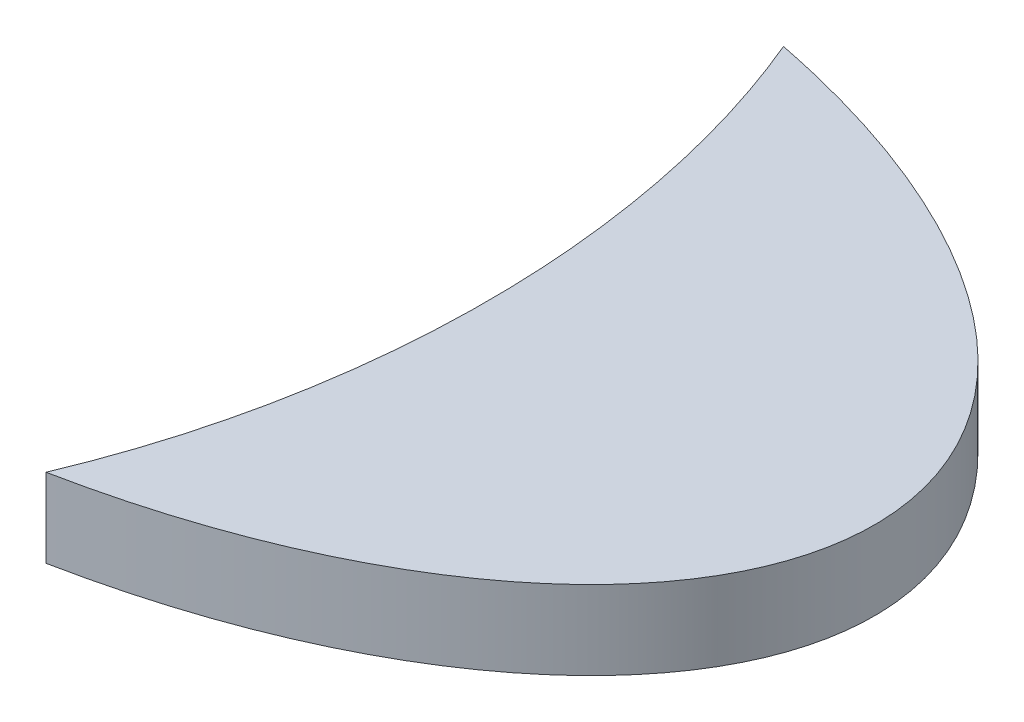
ISO-10303-21;
HEADER;
FILE_DESCRIPTION(('STEP AP214'),'2;1');
FILE_NAME('part.step','',(''),(''),'','','');
FILE_SCHEMA(('AUTOMOTIVE_DESIGN { 1 0 10303 214 1 1 1 1 }'));
ENDSEC;
DATA;
#1=APPLICATION_CONTEXT('core data for automotive mechanical design processes');
#2=APPLICATION_PROTOCOL_DEFINITION('international standard','automotive_design',2000,#1);
#3=PRODUCT_CONTEXT('',#1,'mechanical');
#4=PRODUCT('Part','Part','',(#3));
#5=PRODUCT_RELATED_PRODUCT_CATEGORY('part','',(#4));
#6=PRODUCT_DEFINITION_FORMATION('','',#4);
#7=PRODUCT_DEFINITION_CONTEXT('part definition',#1,'design');
#8=PRODUCT_DEFINITION('design','',#6,#7);
#9=PRODUCT_DEFINITION_SHAPE('','',#8);
#10=(LENGTH_UNIT() NAMED_UNIT(*) SI_UNIT(.MILLI.,.METRE.));
#11=(NAMED_UNIT(*) PLANE_ANGLE_UNIT() SI_UNIT($,.RADIAN.));
#12=(NAMED_UNIT(*) SI_UNIT($,.STERADIAN.) SOLID_ANGLE_UNIT());
#13=UNCERTAINTY_MEASURE_WITH_UNIT(LENGTH_MEASURE(1.E-05),#10,'distance_accuracy_value','');
#14=(GEOMETRIC_REPRESENTATION_CONTEXT(3) GLOBAL_UNCERTAINTY_ASSIGNED_CONTEXT((#13)) GLOBAL_UNIT_ASSIGNED_CONTEXT((#10,
#11,#12)) REPRESENTATION_CONTEXT('',''));
#15=CARTESIAN_POINT('',(0.,0.,0.));
#16=DIRECTION('',(0.,0.,1.));
#17=DIRECTION('',(1.,0.,0.));
#18=AXIS2_PLACEMENT_3D('',#15,#16,#17);
#19=CARTESIAN_POINT('',(-8.11,2.,0.));
#20=DIRECTION('',(0.,1.,0.));
#21=DIRECTION('',(0.,0.,-1.));
#22=AXIS2_PLACEMENT_3D('',#19,#20,#21);
#23=ELLIPSE('',#22,19.88,15.66);
#24=DIRECTION('',(0.,-1.,0.));
#25=VECTOR('',#24,1.);
#26=SURFACE_OF_LINEAR_EXTRUSION('',#23,#25);
#27=CARTESIAN_POINT('',(-8.11,0.,0.));
#28=DIRECTION('',(0.,1.,0.));
#29=DIRECTION('',(0.,0.,-1.));
#30=AXIS2_PLACEMENT_3D('',#27,#28,#29);
#31=ELLIPSE('',#30,19.88,15.66);
#32=CARTESIAN_POINT('',(5.70994794401995,0.,9.34981533351488));
#33=VERTEX_POINT('',#32);
#34=CARTESIAN_POINT('',(5.70994794401995,0.,-9.34981533351488));
#35=VERTEX_POINT('',#34);
#36=EDGE_CURVE('E65',#33,#35,#31,.T.);
#37=ORIENTED_EDGE('',*,*,#36,.F.);
#38=DIRECTION('',(0.,-1.,0.));
#39=VECTOR('',#38,1.);
#40=CARTESIAN_POINT('',(5.70994794401995,2.,9.34981533351488));
#41=LINE('',#40,#39);
#42=CARTESIAN_POINT('',(5.70994794401995,2.,9.34981533351488));
#43=VERTEX_POINT('',#42);
#44=EDGE_CURVE('E11',#43,#33,#41,.T.);
#45=ORIENTED_EDGE('',*,*,#44,.F.);
#46=CARTESIAN_POINT('',(5.70994794401995,2.,-9.34981533351488));
#47=VERTEX_POINT('',#46);
#48=EDGE_CURVE('E66',#43,#47,#23,.T.);
#49=ORIENTED_EDGE('',*,*,#48,.T.);
#50=DIRECTION('',(0.,-1.,0.));
#51=VECTOR('',#50,1.);
#52=CARTESIAN_POINT('',(5.70994794401995,2.,-9.34981533351488));
#53=LINE('',#52,#51);
#54=EDGE_CURVE('E45',#47,#35,#53,.T.);
#55=ORIENTED_EDGE('',*,*,#54,.T.);
#56=EDGE_LOOP('',(#37,#45,#49,#55));
#57=FACE_BOUND('',#56,.T.);
#58=ADVANCED_FACE('F36',(#57),#26,.T.);
#59=CARTESIAN_POINT('',(0.,2.,0.));
#60=DIRECTION('',(0.,1.,0.));
#61=DIRECTION('',(1.,0.,0.));
#62=AXIS2_PLACEMENT_3D('',#59,#60,#61);
#63=ELLIPSE('',#62,17.37,9.9);
#64=DIRECTION('',(0.,-1.,0.));
#65=VECTOR('',#64,1.);
#66=SURFACE_OF_LINEAR_EXTRUSION('',#63,#65);
#67=CARTESIAN_POINT('',(0.,0.,0.));
#68=DIRECTION('',(0.,1.,0.));
#69=DIRECTION('',(1.,0.,0.));
#70=AXIS2_PLACEMENT_3D('',#67,#68,#69);
#71=ELLIPSE('',#70,17.37,9.9);
#72=EDGE_CURVE('E67',#33,#35,#71,.T.);
#73=ORIENTED_EDGE('',*,*,#72,.T.);
#74=ORIENTED_EDGE('',*,*,#54,.F.);
#75=EDGE_CURVE('E52',#43,#47,#63,.T.);
#76=ORIENTED_EDGE('',*,*,#75,.F.);
#77=ORIENTED_EDGE('',*,*,#44,.T.);
#78=EDGE_LOOP('',(#73,#74,#76,#77));
#79=FACE_BOUND('',#78,.T.);
#80=ADVANCED_FACE('F68',(#79),#66,.F.);
#81=CARTESIAN_POINT('',(0.,2.,0.));
#82=DIRECTION('',(0.,1.,0.));
#83=DIRECTION('',(0.,0.,1.));
#84=AXIS2_PLACEMENT_3D('',#81,#82,#83);
#85=PLANE('',#84);
#86=ORIENTED_EDGE('',*,*,#48,.F.);
#87=ORIENTED_EDGE('',*,*,#75,.T.);
#88=EDGE_LOOP('',(#86,#87));
#89=FACE_BOUND('',#88,.T.);
#90=ADVANCED_FACE('F78',(#89),#85,.T.);
#91=CARTESIAN_POINT('',(0.,0.,0.));
#92=DIRECTION('',(0.,1.,0.));
#93=DIRECTION('',(0.,0.,1.));
#94=AXIS2_PLACEMENT_3D('',#91,#92,#93);
#95=PLANE('',#94);
#96=ORIENTED_EDGE('',*,*,#36,.T.);
#97=ORIENTED_EDGE('',*,*,#72,.F.);
#98=EDGE_LOOP('',(#96,#97));
#99=FACE_BOUND('',#98,.T.);
#100=ADVANCED_FACE('F71',(#99),#95,.F.);
#101=CLOSED_SHELL('',(#58,#80,#90,#100));
#102=MANIFOLD_SOLID_BREP('B2',#101);
#103=ADVANCED_BREP_SHAPE_REPRESENTATION('',(#18,#102),#14);
#104=SHAPE_DEFINITION_REPRESENTATION(#9,#103);
ENDSEC;
END-ISO-10303-21;
